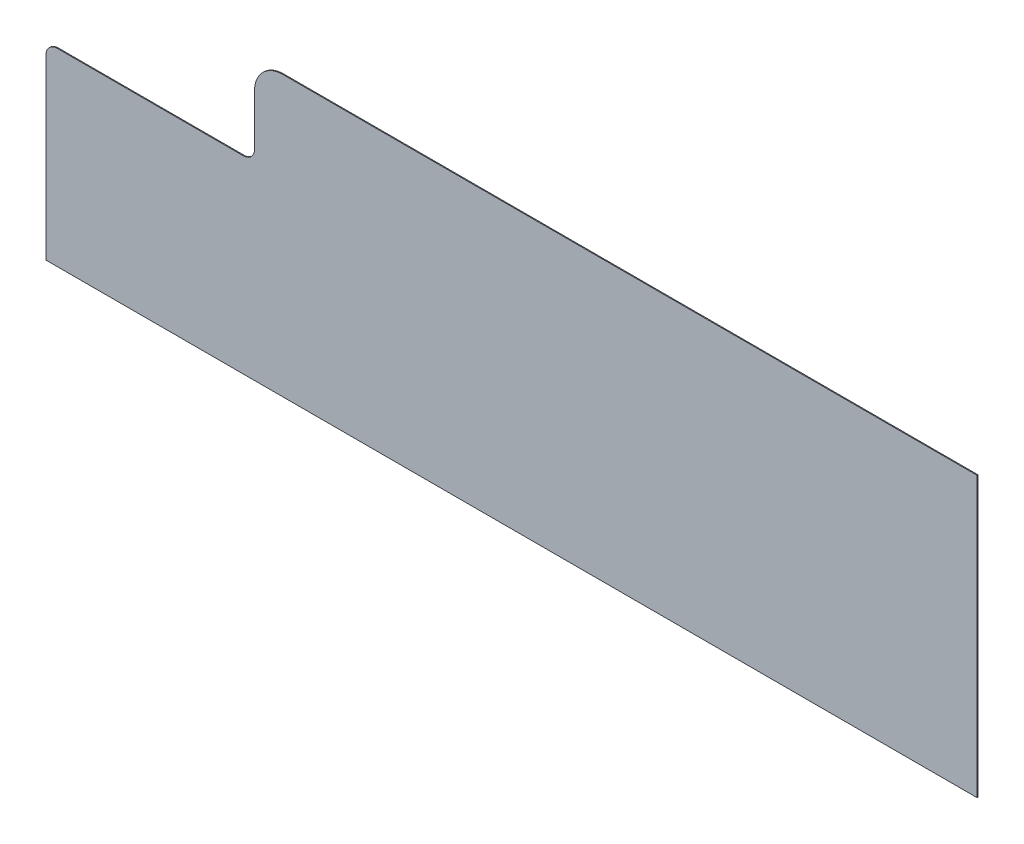
ISO-10303-21;
HEADER;
FILE_DESCRIPTION(('STEP AP214'),'2;1');
FILE_NAME('part.step','',(''),(''),'','','');
FILE_SCHEMA(('AUTOMOTIVE_DESIGN { 1 0 10303 214 1 1 1 1 }'));
ENDSEC;
DATA;
#1=APPLICATION_CONTEXT('core data for automotive mechanical design processes');
#2=APPLICATION_PROTOCOL_DEFINITION('international standard','automotive_design',2000,#1);
#3=PRODUCT_CONTEXT('',#1,'mechanical');
#4=PRODUCT('Part','Part','',(#3));
#5=PRODUCT_RELATED_PRODUCT_CATEGORY('part','',(#4));
#6=PRODUCT_DEFINITION_FORMATION('','',#4);
#7=PRODUCT_DEFINITION_CONTEXT('part definition',#1,'design');
#8=PRODUCT_DEFINITION('design','',#6,#7);
#9=PRODUCT_DEFINITION_SHAPE('','',#8);
#10=(LENGTH_UNIT() NAMED_UNIT(*) SI_UNIT(.MILLI.,.METRE.));
#11=(NAMED_UNIT(*) PLANE_ANGLE_UNIT() SI_UNIT($,.RADIAN.));
#12=(NAMED_UNIT(*) SI_UNIT($,.STERADIAN.) SOLID_ANGLE_UNIT());
#13=UNCERTAINTY_MEASURE_WITH_UNIT(LENGTH_MEASURE(1.E-05),#10,'distance_accuracy_value','');
#14=(GEOMETRIC_REPRESENTATION_CONTEXT(3) GLOBAL_UNCERTAINTY_ASSIGNED_CONTEXT((#13)) GLOBAL_UNIT_ASSIGNED_CONTEXT((#10,
#11,#12)) REPRESENTATION_CONTEXT('',''));
#15=CARTESIAN_POINT('',(0.,0.,0.));
#16=DIRECTION('',(0.,0.,1.));
#17=DIRECTION('',(1.,0.,0.));
#18=AXIS2_PLACEMENT_3D('',#15,#16,#17);
#19=CARTESIAN_POINT('',(555.459088730434,203.132185628742,-1.5875));
#20=DIRECTION('',(1.,0.,0.));
#21=DIRECTION('',(0.,1.,0.));
#22=AXIS2_PLACEMENT_3D('',#19,#20,#21);
#23=PLANE('',#22);
#24=DIRECTION('',(0.,1.,0.));
#25=VECTOR('',#24,1.);
#26=CARTESIAN_POINT('',(555.459088730434,203.132185628742,0.));
#27=LINE('',#26,#25);
#28=CARTESIAN_POINT('',(555.459088730434,-292.267814371258,0.));
#29=VERTEX_POINT('',#28);
#30=CARTESIAN_POINT('',(555.459088730434,203.132185628742,0.));
#31=VERTEX_POINT('',#30);
#32=EDGE_CURVE('E147',#29,#31,#27,.T.);
#33=ORIENTED_EDGE('',*,*,#32,.F.);
#34=DIRECTION('',(0.,0.,1.));
#35=VECTOR('',#34,1.);
#36=CARTESIAN_POINT('',(555.459088730434,-292.267814371258,-1.5875));
#37=LINE('',#36,#35);
#38=CARTESIAN_POINT('',(555.459088730434,-292.267814371258,-1.5875));
#39=VERTEX_POINT('',#38);
#40=EDGE_CURVE('E135',#39,#29,#37,.T.);
#41=ORIENTED_EDGE('',*,*,#40,.F.);
#42=DIRECTION('',(0.,1.,0.));
#43=VECTOR('',#42,1.);
#44=CARTESIAN_POINT('',(555.459088730434,203.132185628742,-1.5875));
#45=LINE('',#44,#43);
#46=CARTESIAN_POINT('',(555.459088730434,203.132185628742,-1.5875));
#47=VERTEX_POINT('',#46);
#48=EDGE_CURVE('E128',#39,#47,#45,.T.);
#49=ORIENTED_EDGE('',*,*,#48,.T.);
#50=DIRECTION('',(0.,0.,1.));
#51=VECTOR('',#50,1.);
#52=CARTESIAN_POINT('',(555.459088730434,203.132185628742,-1.5875));
#53=LINE('',#52,#51);
#54=EDGE_CURVE('E109',#47,#31,#53,.T.);
#55=ORIENTED_EDGE('',*,*,#54,.T.);
#56=EDGE_LOOP('',(#33,#41,#49,#55));
#57=FACE_BOUND('',#56,.T.);
#58=ADVANCED_FACE('F40',(#57),#23,.T.);
#59=CARTESIAN_POINT('',(-1096.54091126957,-292.267814371258,-1.5875));
#60=DIRECTION('',(0.,-1.,0.));
#61=DIRECTION('',(0.,0.,-1.));
#62=AXIS2_PLACEMENT_3D('',#59,#60,#61);
#63=PLANE('',#62);
#64=DIRECTION('',(1.,0.,0.));
#65=VECTOR('',#64,1.);
#66=CARTESIAN_POINT('',(-1096.54091126957,-292.267814371258,0.));
#67=LINE('',#66,#65);
#68=CARTESIAN_POINT('',(-1096.54091126957,-292.267814371258,0.));
#69=VERTEX_POINT('',#68);
#70=EDGE_CURVE('E136',#69,#29,#67,.T.);
#71=ORIENTED_EDGE('',*,*,#70,.F.);
#72=DIRECTION('',(0.,0.,1.));
#73=VECTOR('',#72,1.);
#74=CARTESIAN_POINT('',(-1096.54091126957,-292.267814371258,-1.5875));
#75=LINE('',#74,#73);
#76=CARTESIAN_POINT('',(-1096.54091126957,-292.267814371258,-1.5875));
#77=VERTEX_POINT('',#76);
#78=EDGE_CURVE('E121',#77,#69,#75,.T.);
#79=ORIENTED_EDGE('',*,*,#78,.F.);
#80=DIRECTION('',(1.,0.,0.));
#81=VECTOR('',#80,1.);
#82=CARTESIAN_POINT('',(-1096.54091126957,-292.267814371258,-1.5875));
#83=LINE('',#82,#81);
#84=EDGE_CURVE('E122',#77,#39,#83,.T.);
#85=ORIENTED_EDGE('',*,*,#84,.T.);
#86=ORIENTED_EDGE('',*,*,#40,.T.);
#87=EDGE_LOOP('',(#71,#79,#85,#86));
#88=FACE_BOUND('',#87,.T.);
#89=ADVANCED_FACE('F200',(#88),#63,.T.);
#90=CARTESIAN_POINT('',(-1096.54091126957,203.132185628742,-1.5875));
#91=DIRECTION('',(-1.,0.,0.));
#92=DIRECTION('',(0.,0.,1.));
#93=AXIS2_PLACEMENT_3D('',#90,#91,#92);
#94=PLANE('',#93);
#95=DIRECTION('',(0.,-1.,0.));
#96=VECTOR('',#95,1.);
#97=CARTESIAN_POINT('',(-1096.54091126957,203.132185628742,0.));
#98=LINE('',#97,#96);
#99=CARTESIAN_POINT('',(-1096.54091126957,23.1321856287424,0.));
#100=VERTEX_POINT('',#99);
#101=EDGE_CURVE('E139',#100,#69,#98,.T.);
#102=ORIENTED_EDGE('',*,*,#101,.F.);
#103=DIRECTION('',(0.,0.,1.));
#104=VECTOR('',#103,1.);
#105=CARTESIAN_POINT('',(-1096.54091126957,23.1321856287424,-1.5875));
#106=LINE('',#105,#104);
#107=CARTESIAN_POINT('',(-1096.54091126957,23.1321856287424,-1.5875));
#108=VERTEX_POINT('',#107);
#109=EDGE_CURVE('E48',#100,#108,#106,.F.);
#110=ORIENTED_EDGE('',*,*,#109,.T.);
#111=DIRECTION('',(0.,-1.,0.));
#112=VECTOR('',#111,1.);
#113=CARTESIAN_POINT('',(-1096.54091126957,203.132185628742,-1.5875));
#114=LINE('',#113,#112);
#115=EDGE_CURVE('E133',#108,#77,#114,.T.);
#116=ORIENTED_EDGE('',*,*,#115,.T.);
#117=ORIENTED_EDGE('',*,*,#78,.T.);
#118=EDGE_LOOP('',(#102,#110,#116,#117));
#119=FACE_BOUND('',#118,.T.);
#120=ADVANCED_FACE('F211',(#119),#94,.T.);
#121=CARTESIAN_POINT('',(-1096.54091126957,203.132185628742,-1.5875));
#122=DIRECTION('',(0.,1.,0.));
#123=DIRECTION('',(0.,0.,1.));
#124=AXIS2_PLACEMENT_3D('',#121,#122,#123);
#125=PLANE('',#124);
#126=DIRECTION('',(-1.,0.,0.));
#127=VECTOR('',#126,1.);
#128=CARTESIAN_POINT('',(-1096.54091126957,203.132185628742,-1.5875));
#129=LINE('',#128,#127);
#130=CARTESIAN_POINT('',(-676.540911269566,203.132185628742,-1.5875));
#131=VERTEX_POINT('',#130);
#132=EDGE_CURVE('E113',#47,#131,#129,.T.);
#133=ORIENTED_EDGE('',*,*,#132,.T.);
#134=DIRECTION('',(0.,0.,1.));
#135=VECTOR('',#134,1.);
#136=CARTESIAN_POINT('',(-676.540911269566,203.132185628742,0.));
#137=LINE('',#136,#135);
#138=CARTESIAN_POINT('',(-676.540911269566,203.132185628742,0.));
#139=VERTEX_POINT('',#138);
#140=EDGE_CURVE('E165',#131,#139,#137,.T.);
#141=ORIENTED_EDGE('',*,*,#140,.T.);
#142=DIRECTION('',(-1.,0.,0.));
#143=VECTOR('',#142,1.);
#144=CARTESIAN_POINT('',(-1096.54091126957,203.132185628742,0.));
#145=LINE('',#144,#143);
#146=EDGE_CURVE('E116',#31,#139,#145,.T.);
#147=ORIENTED_EDGE('',*,*,#146,.F.);
#148=ORIENTED_EDGE('',*,*,#54,.F.);
#149=EDGE_LOOP('',(#133,#141,#147,#148));
#150=FACE_BOUND('',#149,.T.);
#151=ADVANCED_FACE('F111',(#150),#125,.T.);
#152=CARTESIAN_POINT('',(0.,0.,-1.5875));
#153=DIRECTION('',(0.,0.,1.));
#154=DIRECTION('',(1.,0.,0.));
#155=AXIS2_PLACEMENT_3D('',#152,#153,#154);
#156=PLANE('',#155);
#157=ORIENTED_EDGE('',*,*,#115,.F.);
#158=CARTESIAN_POINT('',(-1076.54091126957,23.1321856287424,-1.5875));
#159=DIRECTION('',(0.,0.,1.));
#160=DIRECTION('',(1.,0.,0.));
#161=AXIS2_PLACEMENT_3D('',#158,#159,#160);
#162=CIRCLE('',#161,20.);
#163=CARTESIAN_POINT('',(-1076.54091126957,43.1321856287424,-1.5875));
#164=VERTEX_POINT('',#163);
#165=EDGE_CURVE('E11',#108,#164,#162,.F.);
#166=ORIENTED_EDGE('',*,*,#165,.T.);
#167=DIRECTION('',(1.,0.,0.));
#168=VECTOR('',#167,1.);
#169=CARTESIAN_POINT('',(0.,43.1321856287424,-1.5875));
#170=LINE('',#169,#168);
#171=CARTESIAN_POINT('',(-746.540911269566,43.1321856287424,-1.5875));
#172=VERTEX_POINT('',#171);
#173=EDGE_CURVE('E180',#164,#172,#170,.T.);
#174=ORIENTED_EDGE('',*,*,#173,.T.);
#175=CARTESIAN_POINT('',(-746.540911269566,63.1321856287424,-1.5875));
#176=DIRECTION('',(0.,0.,1.));
#177=DIRECTION('',(1.,0.,0.));
#178=AXIS2_PLACEMENT_3D('',#175,#176,#177);
#179=CIRCLE('',#178,20.);
#180=CARTESIAN_POINT('',(-726.540911269566,63.1321856287424,-1.5875));
#181=VERTEX_POINT('',#180);
#182=EDGE_CURVE('E163',#172,#181,#179,.T.);
#183=ORIENTED_EDGE('',*,*,#182,.T.);
#184=DIRECTION('',(0.,1.,0.));
#185=VECTOR('',#184,1.);
#186=CARTESIAN_POINT('',(-726.540911269566,-5.04139030014759E-13,-1.5875));
#187=LINE('',#186,#185);
#188=CARTESIAN_POINT('',(-726.540911269566,153.132185628742,-1.5875));
#189=VERTEX_POINT('',#188);
#190=EDGE_CURVE('E142',#181,#189,#187,.T.);
#191=ORIENTED_EDGE('',*,*,#190,.T.);
#192=CARTESIAN_POINT('',(-676.540911269566,153.132185628742,-1.5875));
#193=DIRECTION('',(0.,0.,1.));
#194=DIRECTION('',(1.,0.,0.));
#195=AXIS2_PLACEMENT_3D('',#192,#193,#194);
#196=CIRCLE('',#195,50.);
#197=EDGE_CURVE('E132',#189,#131,#196,.F.);
#198=ORIENTED_EDGE('',*,*,#197,.T.);
#199=ORIENTED_EDGE('',*,*,#132,.F.);
#200=ORIENTED_EDGE('',*,*,#48,.F.);
#201=ORIENTED_EDGE('',*,*,#84,.F.);
#202=EDGE_LOOP('',(#157,#166,#174,#183,#191,#198,#199,#200,#201));
#203=FACE_BOUND('',#202,.T.);
#204=ADVANCED_FACE('F126',(#203),#156,.F.);
#205=CARTESIAN_POINT('',(0.,0.,0.));
#206=DIRECTION('',(0.,0.,1.));
#207=DIRECTION('',(1.,0.,0.));
#208=AXIS2_PLACEMENT_3D('',#205,#206,#207);
#209=PLANE('',#208);
#210=DIRECTION('',(1.,0.,0.));
#211=VECTOR('',#210,1.);
#212=CARTESIAN_POINT('',(-1096.54091126957,43.1321856287424,0.));
#213=LINE('',#212,#211);
#214=CARTESIAN_POINT('',(-1076.54091126957,43.1321856287424,0.));
#215=VERTEX_POINT('',#214);
#216=CARTESIAN_POINT('',(-746.540911269566,43.1321856287424,0.));
#217=VERTEX_POINT('',#216);
#218=EDGE_CURVE('E179',#215,#217,#213,.T.);
#219=ORIENTED_EDGE('',*,*,#218,.F.);
#220=CARTESIAN_POINT('',(-1076.54091126957,23.1321856287424,0.));
#221=DIRECTION('',(0.,0.,1.));
#222=DIRECTION('',(1.,0.,0.));
#223=AXIS2_PLACEMENT_3D('',#220,#221,#222);
#224=CIRCLE('',#223,20.);
#225=EDGE_CURVE('E62',#215,#100,#224,.T.);
#226=ORIENTED_EDGE('',*,*,#225,.T.);
#227=ORIENTED_EDGE('',*,*,#101,.T.);
#228=ORIENTED_EDGE('',*,*,#70,.T.);
#229=ORIENTED_EDGE('',*,*,#32,.T.);
#230=ORIENTED_EDGE('',*,*,#146,.T.);
#231=CARTESIAN_POINT('',(-676.540911269566,153.132185628742,0.));
#232=DIRECTION('',(0.,0.,1.));
#233=DIRECTION('',(1.,0.,0.));
#234=AXIS2_PLACEMENT_3D('',#231,#232,#233);
#235=CIRCLE('',#234,50.);
#236=CARTESIAN_POINT('',(-726.540911269566,153.132185628742,0.));
#237=VERTEX_POINT('',#236);
#238=EDGE_CURVE('E167',#139,#237,#235,.T.);
#239=ORIENTED_EDGE('',*,*,#238,.T.);
#240=DIRECTION('',(0.,1.,0.));
#241=VECTOR('',#240,1.);
#242=CARTESIAN_POINT('',(-726.540911269566,43.1321856287424,0.));
#243=LINE('',#242,#241);
#244=CARTESIAN_POINT('',(-726.540911269566,63.1321856287424,0.));
#245=VERTEX_POINT('',#244);
#246=EDGE_CURVE('E186',#245,#237,#243,.T.);
#247=ORIENTED_EDGE('',*,*,#246,.F.);
#248=CARTESIAN_POINT('',(-746.540911269566,63.1321856287424,0.));
#249=DIRECTION('',(0.,0.,1.));
#250=DIRECTION('',(1.,0.,0.));
#251=AXIS2_PLACEMENT_3D('',#248,#249,#250);
#252=CIRCLE('',#251,20.);
#253=EDGE_CURVE('E160',#245,#217,#252,.F.);
#254=ORIENTED_EDGE('',*,*,#253,.T.);
#255=EDGE_LOOP('',(#219,#226,#227,#228,#229,#230,#239,#247,#254));
#256=FACE_BOUND('',#255,.T.);
#257=ADVANCED_FACE('F183',(#256),#209,.T.);
#258=CARTESIAN_POINT('',(-726.540911269566,43.1321856287424,-10.));
#259=DIRECTION('',(1.,0.,0.));
#260=DIRECTION('',(0.,1.,0.));
#261=AXIS2_PLACEMENT_3D('',#258,#259,#260);
#262=PLANE('',#261);
#263=ORIENTED_EDGE('',*,*,#246,.T.);
#264=DIRECTION('',(0.,0.,1.));
#265=VECTOR('',#264,1.);
#266=CARTESIAN_POINT('',(-726.540911269566,153.132185628742,-1.5875));
#267=LINE('',#266,#265);
#268=EDGE_CURVE('E169',#237,#189,#267,.F.);
#269=ORIENTED_EDGE('',*,*,#268,.T.);
#270=ORIENTED_EDGE('',*,*,#190,.F.);
#271=DIRECTION('',(0.,0.,1.));
#272=VECTOR('',#271,1.);
#273=CARTESIAN_POINT('',(-726.540911269566,63.1321856287424,0.));
#274=LINE('',#273,#272);
#275=EDGE_CURVE('E152',#181,#245,#274,.T.);
#276=ORIENTED_EDGE('',*,*,#275,.T.);
#277=EDGE_LOOP('',(#263,#269,#270,#276));
#278=FACE_BOUND('',#277,.T.);
#279=ADVANCED_FACE('F221',(#278),#262,.F.);
#280=CARTESIAN_POINT('',(-1096.54091126957,43.1321856287424,-10.));
#281=DIRECTION('',(0.,-1.,0.));
#282=DIRECTION('',(0.,0.,-1.));
#283=AXIS2_PLACEMENT_3D('',#280,#281,#282);
#284=PLANE('',#283);
#285=ORIENTED_EDGE('',*,*,#173,.F.);
#286=DIRECTION('',(0.,0.,1.));
#287=VECTOR('',#286,1.);
#288=CARTESIAN_POINT('',(-1076.54091126957,43.1321856287424,0.));
#289=LINE('',#288,#287);
#290=EDGE_CURVE('E172',#164,#215,#289,.T.);
#291=ORIENTED_EDGE('',*,*,#290,.T.);
#292=ORIENTED_EDGE('',*,*,#218,.T.);
#293=DIRECTION('',(0.,0.,1.));
#294=VECTOR('',#293,1.);
#295=CARTESIAN_POINT('',(-746.540911269566,43.1321856287424,-1.5875));
#296=LINE('',#295,#294);
#297=EDGE_CURVE('E157',#217,#172,#296,.F.);
#298=ORIENTED_EDGE('',*,*,#297,.T.);
#299=EDGE_LOOP('',(#285,#291,#292,#298));
#300=FACE_BOUND('',#299,.T.);
#301=ADVANCED_FACE('F178',(#300),#284,.F.);
#302=CARTESIAN_POINT('',(-746.540911269566,63.1321856287424,-10.));
#303=DIRECTION('',(0.,0.,-1.));
#304=DIRECTION('',(-1.,0.,0.));
#305=AXIS2_PLACEMENT_3D('',#302,#303,#304);
#306=CYLINDRICAL_SURFACE('',#305,20.);
#307=ORIENTED_EDGE('',*,*,#182,.F.);
#308=ORIENTED_EDGE('',*,*,#297,.F.);
#309=ORIENTED_EDGE('',*,*,#253,.F.);
#310=ORIENTED_EDGE('',*,*,#275,.F.);
#311=EDGE_LOOP('',(#307,#308,#309,#310));
#312=FACE_BOUND('',#311,.T.);
#313=ADVANCED_FACE('F205',(#312),#306,.F.);
#314=CARTESIAN_POINT('',(-676.540911269566,153.132185628742,-1.5875));
#315=DIRECTION('',(0.,0.,-1.));
#316=DIRECTION('',(-1.,0.,0.));
#317=AXIS2_PLACEMENT_3D('',#314,#315,#316);
#318=CYLINDRICAL_SURFACE('',#317,50.);
#319=ORIENTED_EDGE('',*,*,#197,.F.);
#320=ORIENTED_EDGE('',*,*,#268,.F.);
#321=ORIENTED_EDGE('',*,*,#238,.F.);
#322=ORIENTED_EDGE('',*,*,#140,.F.);
#323=EDGE_LOOP('',(#319,#320,#321,#322));
#324=FACE_BOUND('',#323,.T.);
#325=ADVANCED_FACE('F196',(#324),#318,.T.);
#326=CARTESIAN_POINT('',(-1076.54091126957,23.1321856287424,-10.));
#327=DIRECTION('',(0.,0.,-1.));
#328=DIRECTION('',(-1.,0.,0.));
#329=AXIS2_PLACEMENT_3D('',#326,#327,#328);
#330=CYLINDRICAL_SURFACE('',#329,20.);
#331=ORIENTED_EDGE('',*,*,#165,.F.);
#332=ORIENTED_EDGE('',*,*,#109,.F.);
#333=ORIENTED_EDGE('',*,*,#225,.F.);
#334=ORIENTED_EDGE('',*,*,#290,.F.);
#335=EDGE_LOOP('',(#331,#332,#333,#334));
#336=FACE_BOUND('',#335,.T.);
#337=ADVANCED_FACE('F42',(#336),#330,.T.);
#338=CLOSED_SHELL('',(#58,#89,#120,#151,#204,#257,#279,#301,#313,#325,#337));
#339=MANIFOLD_SOLID_BREP('B2',#338);
#340=ADVANCED_BREP_SHAPE_REPRESENTATION('',(#18,#339),#14);
#341=SHAPE_DEFINITION_REPRESENTATION(#9,#340);
ENDSEC;
END-ISO-10303-21;
